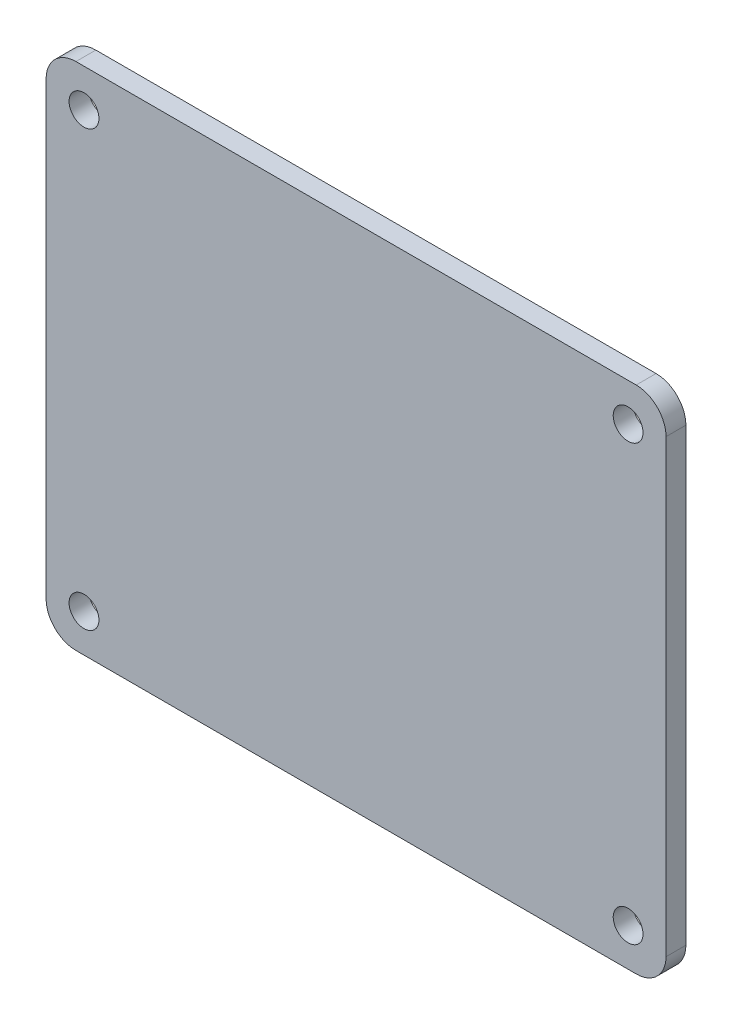
ISO-10303-21;
HEADER;
FILE_DESCRIPTION(('STEP AP214'),'2;1');
FILE_NAME('part.step','',(''),(''),'','','');
FILE_SCHEMA(('AUTOMOTIVE_DESIGN { 1 0 10303 214 1 1 1 1 }'));
ENDSEC;
DATA;
#1=APPLICATION_CONTEXT('core data for automotive mechanical design processes');
#2=APPLICATION_PROTOCOL_DEFINITION('international standard','automotive_design',2000,#1);
#3=PRODUCT_CONTEXT('',#1,'mechanical');
#4=PRODUCT('Part','Part','',(#3));
#5=PRODUCT_RELATED_PRODUCT_CATEGORY('part','',(#4));
#6=PRODUCT_DEFINITION_FORMATION('','',#4);
#7=PRODUCT_DEFINITION_CONTEXT('part definition',#1,'design');
#8=PRODUCT_DEFINITION('design','',#6,#7);
#9=PRODUCT_DEFINITION_SHAPE('','',#8);
#10=(LENGTH_UNIT() NAMED_UNIT(*) SI_UNIT(.MILLI.,.METRE.));
#11=(NAMED_UNIT(*) PLANE_ANGLE_UNIT() SI_UNIT($,.RADIAN.));
#12=(NAMED_UNIT(*) SI_UNIT($,.STERADIAN.) SOLID_ANGLE_UNIT());
#13=UNCERTAINTY_MEASURE_WITH_UNIT(LENGTH_MEASURE(1.E-05),#10,'distance_accuracy_value','');
#14=(GEOMETRIC_REPRESENTATION_CONTEXT(3) GLOBAL_UNCERTAINTY_ASSIGNED_CONTEXT((#13)) GLOBAL_UNIT_ASSIGNED_CONTEXT((#10,
#11,#12)) REPRESENTATION_CONTEXT('',''));
#15=CARTESIAN_POINT('',(0.,0.,0.));
#16=DIRECTION('',(0.,0.,1.));
#17=DIRECTION('',(1.,0.,0.));
#18=AXIS2_PLACEMENT_3D('',#15,#16,#17);
#19=CARTESIAN_POINT('',(-23.6596965865992,9.54704746439344,2.));
#20=DIRECTION('',(0.,0.,-1.));
#21=DIRECTION('',(-1.,0.,0.));
#22=AXIS2_PLACEMENT_3D('',#19,#20,#21);
#23=CYLINDRICAL_SURFACE('',#22,3.);
#24=CARTESIAN_POINT('',(-23.6596965865992,9.54704746439344,0.));
#25=DIRECTION('',(0.,0.,-1.));
#26=DIRECTION('',(-1.,0.,0.));
#27=AXIS2_PLACEMENT_3D('',#24,#25,#26);
#28=CIRCLE('',#27,3.);
#29=CARTESIAN_POINT('',(-26.6596965865992,9.54704746439342,0.));
#30=VERTEX_POINT('',#29);
#31=CARTESIAN_POINT('',(-23.6596965865992,12.5470474643934,0.));
#32=VERTEX_POINT('',#31);
#33=EDGE_CURVE('E140',#30,#32,#28,.T.);
#34=ORIENTED_EDGE('',*,*,#33,.F.);
#35=DIRECTION('',(0.,0.,-1.));
#36=VECTOR('',#35,1.);
#37=CARTESIAN_POINT('',(-26.6596965865992,9.54704746439342,2.));
#38=LINE('',#37,#36);
#39=CARTESIAN_POINT('',(-26.6596965865992,9.54704746439342,2.));
#40=VERTEX_POINT('',#39);
#41=EDGE_CURVE('E11',#40,#30,#38,.T.);
#42=ORIENTED_EDGE('',*,*,#41,.F.);
#43=CARTESIAN_POINT('',(-23.6596965865992,9.54704746439344,2.));
#44=DIRECTION('',(0.,0.,-1.));
#45=DIRECTION('',(-1.,0.,0.));
#46=AXIS2_PLACEMENT_3D('',#43,#44,#45);
#47=CIRCLE('',#46,3.);
#48=CARTESIAN_POINT('',(-23.6596965865992,12.5470474643934,2.));
#49=VERTEX_POINT('',#48);
#50=EDGE_CURVE('E160',#40,#49,#47,.T.);
#51=ORIENTED_EDGE('',*,*,#50,.T.);
#52=DIRECTION('',(0.,0.,-1.));
#53=VECTOR('',#52,1.);
#54=CARTESIAN_POINT('',(-23.6596965865992,12.5470474643934,2.));
#55=LINE('',#54,#53);
#56=EDGE_CURVE('E48',#49,#32,#55,.T.);
#57=ORIENTED_EDGE('',*,*,#56,.T.);
#58=EDGE_LOOP('',(#34,#42,#51,#57));
#59=FACE_BOUND('',#58,.T.);
#60=ADVANCED_FACE('F45',(#59),#23,.T.);
#61=CARTESIAN_POINT('',(-26.6596965865992,9.54704746439342,2.));
#62=DIRECTION('',(1.,0.,0.));
#63=DIRECTION('',(0.,1.,0.));
#64=AXIS2_PLACEMENT_3D('',#61,#62,#63);
#65=PLANE('',#64);
#66=DIRECTION('',(0.,-1.,0.));
#67=VECTOR('',#66,1.);
#68=CARTESIAN_POINT('',(-26.6596965865992,9.54704746439342,0.));
#69=LINE('',#68,#67);
#70=CARTESIAN_POINT('',(-26.6596965865992,-35.7629525356066,0.));
#71=VERTEX_POINT('',#70);
#72=EDGE_CURVE('E159',#30,#71,#69,.T.);
#73=ORIENTED_EDGE('',*,*,#72,.T.);
#74=DIRECTION('',(0.,0.,-1.));
#75=VECTOR('',#74,1.);
#76=CARTESIAN_POINT('',(-26.6596965865992,-35.7629525356066,2.));
#77=LINE('',#76,#75);
#78=CARTESIAN_POINT('',(-26.6596965865992,-35.7629525356066,2.));
#79=VERTEX_POINT('',#78);
#80=EDGE_CURVE('E54',#79,#71,#77,.T.);
#81=ORIENTED_EDGE('',*,*,#80,.F.);
#82=DIRECTION('',(0.,-1.,0.));
#83=VECTOR('',#82,1.);
#84=CARTESIAN_POINT('',(-26.6596965865992,9.54704746439342,2.));
#85=LINE('',#84,#83);
#86=EDGE_CURVE('E135',#40,#79,#85,.T.);
#87=ORIENTED_EDGE('',*,*,#86,.F.);
#88=ORIENTED_EDGE('',*,*,#41,.T.);
#89=EDGE_LOOP('',(#73,#81,#87,#88));
#90=FACE_BOUND('',#89,.T.);
#91=ADVANCED_FACE('F173',(#90),#65,.F.);
#92=CARTESIAN_POINT('',(-23.6596965865992,-35.7629525356066,2.));
#93=DIRECTION('',(0.,0.,-1.));
#94=DIRECTION('',(-1.,0.,0.));
#95=AXIS2_PLACEMENT_3D('',#92,#93,#94);
#96=CYLINDRICAL_SURFACE('',#95,3.);
#97=CARTESIAN_POINT('',(-23.6596965865992,-35.7629525356066,0.));
#98=DIRECTION('',(0.,0.,-1.));
#99=DIRECTION('',(-1.,0.,0.));
#100=AXIS2_PLACEMENT_3D('',#97,#98,#99);
#101=CIRCLE('',#100,3.);
#102=CARTESIAN_POINT('',(-23.6596965865992,-38.7629525356066,0.));
#103=VERTEX_POINT('',#102);
#104=EDGE_CURVE('E120',#103,#71,#101,.T.);
#105=ORIENTED_EDGE('',*,*,#104,.F.);
#106=DIRECTION('',(0.,0.,-1.));
#107=VECTOR('',#106,1.);
#108=CARTESIAN_POINT('',(-23.6596965865992,-38.7629525356066,2.));
#109=LINE('',#108,#107);
#110=CARTESIAN_POINT('',(-23.6596965865992,-38.7629525356066,2.));
#111=VERTEX_POINT('',#110);
#112=EDGE_CURVE('E114',#111,#103,#109,.T.);
#113=ORIENTED_EDGE('',*,*,#112,.F.);
#114=CARTESIAN_POINT('',(-23.6596965865992,-35.7629525356066,2.));
#115=DIRECTION('',(0.,0.,-1.));
#116=DIRECTION('',(-1.,0.,0.));
#117=AXIS2_PLACEMENT_3D('',#114,#115,#116);
#118=CIRCLE('',#117,3.);
#119=EDGE_CURVE('E118',#111,#79,#118,.T.);
#120=ORIENTED_EDGE('',*,*,#119,.T.);
#121=ORIENTED_EDGE('',*,*,#80,.T.);
#122=EDGE_LOOP('',(#105,#113,#120,#121));
#123=FACE_BOUND('',#122,.T.);
#124=ADVANCED_FACE('F116',(#123),#96,.T.);
#125=CARTESIAN_POINT('',(-23.6596965865992,-38.7629525356066,2.));
#126=DIRECTION('',(0.,1.,0.));
#127=DIRECTION('',(0.,0.,1.));
#128=AXIS2_PLACEMENT_3D('',#125,#126,#127);
#129=PLANE('',#128);
#130=DIRECTION('',(1.,0.,0.));
#131=VECTOR('',#130,1.);
#132=CARTESIAN_POINT('',(-23.6596965865992,-38.7629525356066,0.));
#133=LINE('',#132,#131);
#134=CARTESIAN_POINT('',(32.7003034134008,-38.7629525356066,0.));
#135=VERTEX_POINT('',#134);
#136=EDGE_CURVE('E156',#103,#135,#133,.T.);
#137=ORIENTED_EDGE('',*,*,#136,.T.);
#138=DIRECTION('',(0.,0.,-1.));
#139=VECTOR('',#138,1.);
#140=CARTESIAN_POINT('',(32.7003034134008,-38.7629525356066,2.));
#141=LINE('',#140,#139);
#142=CARTESIAN_POINT('',(32.7003034134008,-38.7629525356066,2.));
#143=VERTEX_POINT('',#142);
#144=EDGE_CURVE('E123',#143,#135,#141,.T.);
#145=ORIENTED_EDGE('',*,*,#144,.F.);
#146=DIRECTION('',(1.,0.,0.));
#147=VECTOR('',#146,1.);
#148=CARTESIAN_POINT('',(-23.6596965865992,-38.7629525356066,2.));
#149=LINE('',#148,#147);
#150=EDGE_CURVE('E126',#111,#143,#149,.T.);
#151=ORIENTED_EDGE('',*,*,#150,.F.);
#152=ORIENTED_EDGE('',*,*,#112,.T.);
#153=EDGE_LOOP('',(#137,#145,#151,#152));
#154=FACE_BOUND('',#153,.T.);
#155=ADVANCED_FACE('F127',(#154),#129,.F.);
#156=CARTESIAN_POINT('',(32.7003034134008,-35.7629525356066,2.));
#157=DIRECTION('',(0.,0.,-1.));
#158=DIRECTION('',(-1.,0.,0.));
#159=AXIS2_PLACEMENT_3D('',#156,#157,#158);
#160=CYLINDRICAL_SURFACE('',#159,3.);
#161=CARTESIAN_POINT('',(32.7003034134008,-35.7629525356066,0.));
#162=DIRECTION('',(0.,0.,1.));
#163=DIRECTION('',(1.,0.,0.));
#164=AXIS2_PLACEMENT_3D('',#161,#162,#163);
#165=CIRCLE('',#164,3.);
#166=CARTESIAN_POINT('',(35.7003034134008,-35.7629525356065,0.));
#167=VERTEX_POINT('',#166);
#168=EDGE_CURVE('E153',#135,#167,#165,.T.);
#169=ORIENTED_EDGE('',*,*,#168,.T.);
#170=DIRECTION('',(0.,0.,-1.));
#171=VECTOR('',#170,1.);
#172=CARTESIAN_POINT('',(35.7003034134008,-35.7629525356065,2.));
#173=LINE('',#172,#171);
#174=CARTESIAN_POINT('',(35.7003034134008,-35.7629525356065,2.));
#175=VERTEX_POINT('',#174);
#176=EDGE_CURVE('E164',#175,#167,#173,.T.);
#177=ORIENTED_EDGE('',*,*,#176,.F.);
#178=CARTESIAN_POINT('',(32.7003034134008,-35.7629525356066,2.));
#179=DIRECTION('',(0.,0.,1.));
#180=DIRECTION('',(1.,0.,0.));
#181=AXIS2_PLACEMENT_3D('',#178,#179,#180);
#182=CIRCLE('',#181,3.);
#183=EDGE_CURVE('E131',#143,#175,#182,.T.);
#184=ORIENTED_EDGE('',*,*,#183,.F.);
#185=ORIENTED_EDGE('',*,*,#144,.T.);
#186=EDGE_LOOP('',(#169,#177,#184,#185));
#187=FACE_BOUND('',#186,.T.);
#188=ADVANCED_FACE('F188',(#187),#160,.T.);
#189=CARTESIAN_POINT('',(35.7003034134008,9.54704746439342,2.));
#190=DIRECTION('',(1.,0.,0.));
#191=DIRECTION('',(0.,1.,0.));
#192=AXIS2_PLACEMENT_3D('',#189,#190,#191);
#193=PLANE('',#192);
#194=DIRECTION('',(0.,-1.,0.));
#195=VECTOR('',#194,1.);
#196=CARTESIAN_POINT('',(35.7003034134008,9.54704746439342,0.));
#197=LINE('',#196,#195);
#198=CARTESIAN_POINT('',(35.7003034134008,9.54704746439342,0.));
#199=VERTEX_POINT('',#198);
#200=EDGE_CURVE('E150',#199,#167,#197,.T.);
#201=ORIENTED_EDGE('',*,*,#200,.F.);
#202=DIRECTION('',(0.,0.,-1.));
#203=VECTOR('',#202,1.);
#204=CARTESIAN_POINT('',(35.7003034134008,9.54704746439342,2.));
#205=LINE('',#204,#203);
#206=CARTESIAN_POINT('',(35.7003034134008,9.54704746439342,2.));
#207=VERTEX_POINT('',#206);
#208=EDGE_CURVE('E166',#207,#199,#205,.T.);
#209=ORIENTED_EDGE('',*,*,#208,.F.);
#210=DIRECTION('',(0.,-1.,0.));
#211=VECTOR('',#210,1.);
#212=CARTESIAN_POINT('',(35.7003034134008,9.54704746439342,2.));
#213=LINE('',#212,#211);
#214=EDGE_CURVE('E183',#207,#175,#213,.T.);
#215=ORIENTED_EDGE('',*,*,#214,.T.);
#216=ORIENTED_EDGE('',*,*,#176,.T.);
#217=EDGE_LOOP('',(#201,#209,#215,#216));
#218=FACE_BOUND('',#217,.T.);
#219=ADVANCED_FACE('F192',(#218),#193,.T.);
#220=CARTESIAN_POINT('',(32.7003034134008,9.54704746439344,2.));
#221=DIRECTION('',(0.,0.,-1.));
#222=DIRECTION('',(-1.,0.,0.));
#223=AXIS2_PLACEMENT_3D('',#220,#221,#222);
#224=CYLINDRICAL_SURFACE('',#223,3.);
#225=CARTESIAN_POINT('',(32.7003034134008,9.54704746439344,0.));
#226=DIRECTION('',(0.,0.,1.));
#227=DIRECTION('',(1.,0.,0.));
#228=AXIS2_PLACEMENT_3D('',#225,#226,#227);
#229=CIRCLE('',#228,3.);
#230=CARTESIAN_POINT('',(32.7003034134007,12.5470474643934,0.));
#231=VERTEX_POINT('',#230);
#232=EDGE_CURVE('E147',#199,#231,#229,.T.);
#233=ORIENTED_EDGE('',*,*,#232,.T.);
#234=DIRECTION('',(0.,0.,-1.));
#235=VECTOR('',#234,1.);
#236=CARTESIAN_POINT('',(32.7003034134007,12.5470474643934,2.));
#237=LINE('',#236,#235);
#238=CARTESIAN_POINT('',(32.7003034134007,12.5470474643934,2.));
#239=VERTEX_POINT('',#238);
#240=EDGE_CURVE('E167',#239,#231,#237,.T.);
#241=ORIENTED_EDGE('',*,*,#240,.F.);
#242=CARTESIAN_POINT('',(32.7003034134008,9.54704746439344,2.));
#243=DIRECTION('',(0.,0.,1.));
#244=DIRECTION('',(1.,0.,0.));
#245=AXIS2_PLACEMENT_3D('',#242,#243,#244);
#246=CIRCLE('',#245,3.);
#247=EDGE_CURVE('E176',#207,#239,#246,.T.);
#248=ORIENTED_EDGE('',*,*,#247,.F.);
#249=ORIENTED_EDGE('',*,*,#208,.T.);
#250=EDGE_LOOP('',(#233,#241,#248,#249));
#251=FACE_BOUND('',#250,.T.);
#252=ADVANCED_FACE('F195',(#251),#224,.T.);
#253=CARTESIAN_POINT('',(-23.6596965865992,12.5470474643934,2.));
#254=DIRECTION('',(0.,1.,0.));
#255=DIRECTION('',(0.,0.,1.));
#256=AXIS2_PLACEMENT_3D('',#253,#254,#255);
#257=PLANE('',#256);
#258=DIRECTION('',(1.,0.,0.));
#259=VECTOR('',#258,1.);
#260=CARTESIAN_POINT('',(-23.6596965865992,12.5470474643934,0.));
#261=LINE('',#260,#259);
#262=EDGE_CURVE('E143',#32,#231,#261,.T.);
#263=ORIENTED_EDGE('',*,*,#262,.F.);
#264=ORIENTED_EDGE('',*,*,#56,.F.);
#265=DIRECTION('',(1.,0.,0.));
#266=VECTOR('',#265,1.);
#267=CARTESIAN_POINT('',(-23.6596965865992,12.5470474643934,2.));
#268=LINE('',#267,#266);
#269=EDGE_CURVE('E174',#49,#239,#268,.T.);
#270=ORIENTED_EDGE('',*,*,#269,.T.);
#271=ORIENTED_EDGE('',*,*,#240,.T.);
#272=EDGE_LOOP('',(#263,#264,#270,#271));
#273=FACE_BOUND('',#272,.T.);
#274=ADVANCED_FACE('F169',(#273),#257,.T.);
#275=CARTESIAN_POINT('',(-23.6596965865992,9.54704746439344,2.));
#276=DIRECTION('',(0.,0.,-1.));
#277=DIRECTION('',(-1.,0.,0.));
#278=AXIS2_PLACEMENT_3D('',#275,#276,#277);
#279=PLANE('',#278);
#280=CARTESIAN_POINT('',(31.8903034134008,-34.9529525356066,2.));
#281=DIRECTION('',(0.,0.,1.));
#282=DIRECTION('',(1.,0.,0.));
#283=AXIS2_PLACEMENT_3D('',#280,#281,#282);
#284=CIRCLE('',#283,1.5);
#285=CARTESIAN_POINT('',(33.3903034134008,-34.9529525356066,2.));
#286=VERTEX_POINT('',#285);
#287=EDGE_CURVE('E303',#286,#286,#284,.T.);
#288=ORIENTED_EDGE('',*,*,#287,.F.);
#289=EDGE_LOOP('',(#288));
#290=FACE_BOUND('',#289,.T.);
#291=CARTESIAN_POINT('',(-22.8496965865992,-34.9529525356066,2.));
#292=DIRECTION('',(0.,0.,1.));
#293=DIRECTION('',(1.,0.,0.));
#294=AXIS2_PLACEMENT_3D('',#291,#292,#293);
#295=CIRCLE('',#294,1.5);
#296=CARTESIAN_POINT('',(-21.3496965865992,-34.9529525356066,2.));
#297=VERTEX_POINT('',#296);
#298=EDGE_CURVE('E307',#297,#297,#295,.T.);
#299=ORIENTED_EDGE('',*,*,#298,.F.);
#300=EDGE_LOOP('',(#299));
#301=FACE_BOUND('',#300,.T.);
#302=CARTESIAN_POINT('',(-22.8496965865992,8.73704746439344,2.));
#303=DIRECTION('',(0.,0.,1.));
#304=DIRECTION('',(1.,0.,0.));
#305=AXIS2_PLACEMENT_3D('',#302,#303,#304);
#306=CIRCLE('',#305,1.5);
#307=CARTESIAN_POINT('',(-21.3496965865992,8.73704746439344,2.));
#308=VERTEX_POINT('',#307);
#309=EDGE_CURVE('E315',#308,#308,#306,.T.);
#310=ORIENTED_EDGE('',*,*,#309,.F.);
#311=EDGE_LOOP('',(#310));
#312=FACE_BOUND('',#311,.T.);
#313=CARTESIAN_POINT('',(31.8903034134008,8.73704746439344,2.));
#314=DIRECTION('',(0.,0.,1.));
#315=DIRECTION('',(1.,0.,0.));
#316=AXIS2_PLACEMENT_3D('',#313,#314,#315);
#317=CIRCLE('',#316,1.5);
#318=CARTESIAN_POINT('',(33.3903034134008,8.73704746439344,2.));
#319=VERTEX_POINT('',#318);
#320=EDGE_CURVE('E179',#319,#319,#317,.T.);
#321=ORIENTED_EDGE('',*,*,#320,.F.);
#322=EDGE_LOOP('',(#321));
#323=FACE_BOUND('',#322,.T.);
#324=ORIENTED_EDGE('',*,*,#50,.F.);
#325=ORIENTED_EDGE('',*,*,#86,.T.);
#326=ORIENTED_EDGE('',*,*,#119,.F.);
#327=ORIENTED_EDGE('',*,*,#150,.T.);
#328=ORIENTED_EDGE('',*,*,#183,.T.);
#329=ORIENTED_EDGE('',*,*,#214,.F.);
#330=ORIENTED_EDGE('',*,*,#247,.T.);
#331=ORIENTED_EDGE('',*,*,#269,.F.);
#332=EDGE_LOOP('',(#324,#325,#326,#327,#328,#329,#330,#331));
#333=FACE_BOUND('',#332,.T.);
#334=ADVANCED_FACE('F134',(#290,#301,#312,#323,#333),#279,.F.);
#335=CARTESIAN_POINT('',(-23.6596965865992,9.54704746439344,0.));
#336=DIRECTION('',(0.,0.,-1.));
#337=DIRECTION('',(-1.,0.,0.));
#338=AXIS2_PLACEMENT_3D('',#335,#336,#337);
#339=PLANE('',#338);
#340=CARTESIAN_POINT('',(31.8903034134008,-34.9529525356066,0.));
#341=DIRECTION('',(0.,0.,1.));
#342=DIRECTION('',(1.,0.,0.));
#343=AXIS2_PLACEMENT_3D('',#340,#341,#342);
#344=CIRCLE('',#343,1.5);
#345=CARTESIAN_POINT('',(33.3903034134008,-34.9529525356066,0.));
#346=VERTEX_POINT('',#345);
#347=EDGE_CURVE('E300',#346,#346,#344,.T.);
#348=ORIENTED_EDGE('',*,*,#347,.T.);
#349=EDGE_LOOP('',(#348));
#350=FACE_BOUND('',#349,.T.);
#351=CARTESIAN_POINT('',(-22.8496965865992,-34.9529525356066,0.));
#352=DIRECTION('',(0.,0.,1.));
#353=DIRECTION('',(1.,0.,0.));
#354=AXIS2_PLACEMENT_3D('',#351,#352,#353);
#355=CIRCLE('',#354,1.5);
#356=CARTESIAN_POINT('',(-21.3496965865992,-34.9529525356066,0.));
#357=VERTEX_POINT('',#356);
#358=EDGE_CURVE('E304',#357,#357,#355,.T.);
#359=ORIENTED_EDGE('',*,*,#358,.T.);
#360=EDGE_LOOP('',(#359));
#361=FACE_BOUND('',#360,.T.);
#362=CARTESIAN_POINT('',(-22.8496965865992,8.73704746439344,0.));
#363=DIRECTION('',(0.,0.,1.));
#364=DIRECTION('',(1.,0.,0.));
#365=AXIS2_PLACEMENT_3D('',#362,#363,#364);
#366=CIRCLE('',#365,1.5);
#367=CARTESIAN_POINT('',(-21.3496965865992,8.73704746439344,0.));
#368=VERTEX_POINT('',#367);
#369=EDGE_CURVE('E319',#368,#368,#366,.T.);
#370=ORIENTED_EDGE('',*,*,#369,.T.);
#371=EDGE_LOOP('',(#370));
#372=FACE_BOUND('',#371,.T.);
#373=CARTESIAN_POINT('',(31.8903034134008,8.73704746439344,0.));
#374=DIRECTION('',(0.,0.,1.));
#375=DIRECTION('',(1.,0.,0.));
#376=AXIS2_PLACEMENT_3D('',#373,#374,#375);
#377=CIRCLE('',#376,1.5);
#378=CARTESIAN_POINT('',(33.3903034134008,8.73704746439344,0.));
#379=VERTEX_POINT('',#378);
#380=EDGE_CURVE('E144',#379,#379,#377,.T.);
#381=ORIENTED_EDGE('',*,*,#380,.T.);
#382=EDGE_LOOP('',(#381));
#383=FACE_BOUND('',#382,.T.);
#384=ORIENTED_EDGE('',*,*,#33,.T.);
#385=ORIENTED_EDGE('',*,*,#262,.T.);
#386=ORIENTED_EDGE('',*,*,#232,.F.);
#387=ORIENTED_EDGE('',*,*,#200,.T.);
#388=ORIENTED_EDGE('',*,*,#168,.F.);
#389=ORIENTED_EDGE('',*,*,#136,.F.);
#390=ORIENTED_EDGE('',*,*,#104,.T.);
#391=ORIENTED_EDGE('',*,*,#72,.F.);
#392=EDGE_LOOP('',(#384,#385,#386,#387,#388,#389,#390,#391));
#393=FACE_BOUND('',#392,.T.);
#394=ADVANCED_FACE('F172',(#350,#361,#372,#383,#393),#339,.T.);
#395=CARTESIAN_POINT('',(31.8903034134008,8.73704746439344,0.));
#396=DIRECTION('',(0.,0.,1.));
#397=DIRECTION('',(1.,0.,0.));
#398=AXIS2_PLACEMENT_3D('',#395,#396,#397);
#399=CYLINDRICAL_SURFACE('',#398,1.5);
#400=ORIENTED_EDGE('',*,*,#380,.F.);
#401=EDGE_LOOP('',(#400));
#402=FACE_BOUND('',#401,.T.);
#403=ORIENTED_EDGE('',*,*,#320,.T.);
#404=EDGE_LOOP('',(#403));
#405=FACE_BOUND('',#404,.T.);
#406=ADVANCED_FACE('F255',(#402,#405),#399,.F.);
#407=CARTESIAN_POINT('',(-22.8496965865992,8.73704746439344,0.));
#408=DIRECTION('',(0.,0.,1.));
#409=DIRECTION('',(1.,0.,0.));
#410=AXIS2_PLACEMENT_3D('',#407,#408,#409);
#411=CYLINDRICAL_SURFACE('',#410,1.5);
#412=ORIENTED_EDGE('',*,*,#369,.F.);
#413=EDGE_LOOP('',(#412));
#414=FACE_BOUND('',#413,.T.);
#415=ORIENTED_EDGE('',*,*,#309,.T.);
#416=EDGE_LOOP('',(#415));
#417=FACE_BOUND('',#416,.T.);
#418=ADVANCED_FACE('F264',(#414,#417),#411,.F.);
#419=CARTESIAN_POINT('',(-22.8496965865992,-34.9529525356066,0.));
#420=DIRECTION('',(0.,0.,1.));
#421=DIRECTION('',(1.,0.,0.));
#422=AXIS2_PLACEMENT_3D('',#419,#420,#421);
#423=CYLINDRICAL_SURFACE('',#422,1.5);
#424=ORIENTED_EDGE('',*,*,#358,.F.);
#425=EDGE_LOOP('',(#424));
#426=FACE_BOUND('',#425,.T.);
#427=ORIENTED_EDGE('',*,*,#298,.T.);
#428=EDGE_LOOP('',(#427));
#429=FACE_BOUND('',#428,.T.);
#430=ADVANCED_FACE('F274',(#426,#429),#423,.F.);
#431=CARTESIAN_POINT('',(31.8903034134008,-34.9529525356066,0.));
#432=DIRECTION('',(0.,0.,1.));
#433=DIRECTION('',(1.,0.,0.));
#434=AXIS2_PLACEMENT_3D('',#431,#432,#433);
#435=CYLINDRICAL_SURFACE('',#434,1.5);
#436=ORIENTED_EDGE('',*,*,#347,.F.);
#437=EDGE_LOOP('',(#436));
#438=FACE_BOUND('',#437,.T.);
#439=ORIENTED_EDGE('',*,*,#287,.T.);
#440=EDGE_LOOP('',(#439));
#441=FACE_BOUND('',#440,.T.);
#442=ADVANCED_FACE('F284',(#438,#441),#435,.F.);
#443=CLOSED_SHELL('',(#60,#91,#124,#155,#188,#219,#252,#274,#334,#394,#406,#418,#430,#442));
#444=MANIFOLD_SOLID_BREP('B2',#443);
#445=ADVANCED_BREP_SHAPE_REPRESENTATION('',(#18,#444),#14);
#446=SHAPE_DEFINITION_REPRESENTATION(#9,#445);
ENDSEC;
END-ISO-10303-21;
